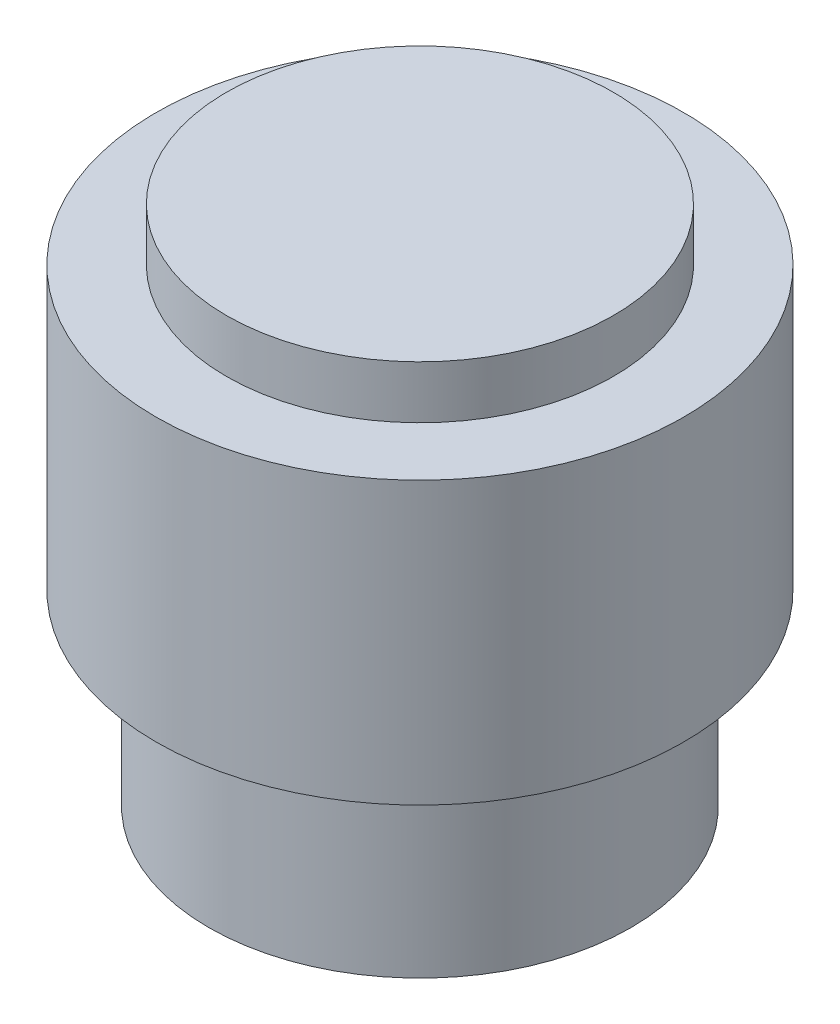
ISO-10303-21;
HEADER;
FILE_DESCRIPTION(('STEP AP214'),'2;1');
FILE_NAME('part.step','',(''),(''),'','','');
FILE_SCHEMA(('AUTOMOTIVE_DESIGN { 1 0 10303 214 1 1 1 1 }'));
ENDSEC;
DATA;
#1=APPLICATION_CONTEXT('core data for automotive mechanical design processes');
#2=APPLICATION_PROTOCOL_DEFINITION('international standard','automotive_design',2000,#1);
#3=PRODUCT_CONTEXT('',#1,'mechanical');
#4=PRODUCT('Part','Part','',(#3));
#5=PRODUCT_RELATED_PRODUCT_CATEGORY('part','',(#4));
#6=PRODUCT_DEFINITION_FORMATION('','',#4);
#7=PRODUCT_DEFINITION_CONTEXT('part definition',#1,'design');
#8=PRODUCT_DEFINITION('design','',#6,#7);
#9=PRODUCT_DEFINITION_SHAPE('','',#8);
#10=(LENGTH_UNIT() NAMED_UNIT(*) SI_UNIT(.MILLI.,.METRE.));
#11=(NAMED_UNIT(*) PLANE_ANGLE_UNIT() SI_UNIT($,.RADIAN.));
#12=(NAMED_UNIT(*) SI_UNIT($,.STERADIAN.) SOLID_ANGLE_UNIT());
#13=UNCERTAINTY_MEASURE_WITH_UNIT(LENGTH_MEASURE(1.E-05),#10,'distance_accuracy_value','');
#14=(GEOMETRIC_REPRESENTATION_CONTEXT(3) GLOBAL_UNCERTAINTY_ASSIGNED_CONTEXT((#13)) GLOBAL_UNIT_ASSIGNED_CONTEXT((#10,
#11,#12)) REPRESENTATION_CONTEXT('',''));
#15=CARTESIAN_POINT('',(0.,0.,0.));
#16=DIRECTION('',(0.,0.,1.));
#17=DIRECTION('',(1.,0.,0.));
#18=AXIS2_PLACEMENT_3D('',#15,#16,#17);
#19=CARTESIAN_POINT('',(0.,1.83,0.));
#20=DIRECTION('',(0.,-1.,0.));
#21=DIRECTION('',(0.,0.,-1.));
#22=AXIS2_PLACEMENT_3D('',#19,#20,#21);
#23=CYLINDRICAL_SURFACE('',#22,6.);
#24=CARTESIAN_POINT('',(0.,-3.5,0.));
#25=DIRECTION('',(0.,1.,0.));
#26=DIRECTION('',(0.,0.,1.));
#27=AXIS2_PLACEMENT_3D('',#24,#25,#26);
#28=CIRCLE('',#27,6.);
#29=CARTESIAN_POINT('',(0.,-3.5,6.));
#30=VERTEX_POINT('',#29);
#31=EDGE_CURVE('E42',#30,#30,#28,.T.);
#32=ORIENTED_EDGE('',*,*,#31,.T.);
#33=EDGE_LOOP('',(#32));
#34=FACE_BOUND('',#33,.T.);
#35=CARTESIAN_POINT('',(0.,1.82,0.));
#36=DIRECTION('',(0.,1.,0.));
#37=DIRECTION('',(0.,0.,1.));
#38=AXIS2_PLACEMENT_3D('',#35,#36,#37);
#39=CIRCLE('',#38,6.);
#40=CARTESIAN_POINT('',(0.,1.82,6.));
#41=VERTEX_POINT('',#40);
#42=EDGE_CURVE('E10',#41,#41,#39,.T.);
#43=ORIENTED_EDGE('',*,*,#42,.F.);
#44=EDGE_LOOP('',(#43));
#45=FACE_BOUND('',#44,.T.);
#46=ADVANCED_FACE('F40',(#34,#45),#23,.T.);
#47=CARTESIAN_POINT('',(0.,-3.5,0.));
#48=DIRECTION('',(0.,1.,0.));
#49=DIRECTION('',(0.,0.,1.));
#50=AXIS2_PLACEMENT_3D('',#47,#48,#49);
#51=PLANE('',#50);
#52=ORIENTED_EDGE('',*,*,#31,.F.);
#53=EDGE_LOOP('',(#52));
#54=FACE_BOUND('',#53,.T.);
#55=ADVANCED_FACE('F84',(#54),#51,.F.);
#56=CARTESIAN_POINT('',(0.,9.82,0.));
#57=DIRECTION('',(0.,-1.,0.));
#58=DIRECTION('',(0.,0.,-1.));
#59=AXIS2_PLACEMENT_3D('',#56,#57,#58);
#60=CYLINDRICAL_SURFACE('',#59,7.5);
#61=CARTESIAN_POINT('',(0.,9.82,0.));
#62=DIRECTION('',(0.,1.,0.));
#63=DIRECTION('',(0.,0.,1.));
#64=AXIS2_PLACEMENT_3D('',#61,#62,#63);
#65=CIRCLE('',#64,7.5);
#66=CARTESIAN_POINT('',(0.,9.82,7.5));
#67=VERTEX_POINT('',#66);
#68=EDGE_CURVE('E48',#67,#67,#65,.T.);
#69=ORIENTED_EDGE('',*,*,#68,.F.);
#70=EDGE_LOOP('',(#69));
#71=FACE_BOUND('',#70,.T.);
#72=CARTESIAN_POINT('',(0.,1.82,0.));
#73=DIRECTION('',(0.,1.,0.));
#74=DIRECTION('',(0.,0.,1.));
#75=AXIS2_PLACEMENT_3D('',#72,#73,#74);
#76=CIRCLE('',#75,7.5);
#77=CARTESIAN_POINT('',(0.,1.82,7.5));
#78=VERTEX_POINT('',#77);
#79=EDGE_CURVE('E51',#78,#78,#76,.T.);
#80=ORIENTED_EDGE('',*,*,#79,.T.);
#81=EDGE_LOOP('',(#80));
#82=FACE_BOUND('',#81,.T.);
#83=ADVANCED_FACE('F87',(#71,#82),#60,.T.);
#84=CARTESIAN_POINT('',(0.,9.82,0.));
#85=DIRECTION('',(0.,1.,0.));
#86=DIRECTION('',(0.,0.,1.));
#87=AXIS2_PLACEMENT_3D('',#84,#85,#86);
#88=PLANE('',#87);
#89=CARTESIAN_POINT('',(0.,9.82,0.));
#90=DIRECTION('',(0.,1.,0.));
#91=DIRECTION('',(0.,0.,1.));
#92=AXIS2_PLACEMENT_3D('',#89,#90,#91);
#93=CIRCLE('',#92,5.5);
#94=CARTESIAN_POINT('',(0.,9.82,5.5));
#95=VERTEX_POINT('',#94);
#96=EDGE_CURVE('E37',#95,#95,#93,.F.);
#97=ORIENTED_EDGE('',*,*,#96,.T.);
#98=EDGE_LOOP('',(#97));
#99=FACE_BOUND('',#98,.T.);
#100=ORIENTED_EDGE('',*,*,#68,.T.);
#101=EDGE_LOOP('',(#100));
#102=FACE_BOUND('',#101,.T.);
#103=ADVANCED_FACE('F65',(#99,#102),#88,.T.);
#104=CARTESIAN_POINT('',(0.,1.82,0.));
#105=DIRECTION('',(0.,1.,0.));
#106=DIRECTION('',(0.,0.,1.));
#107=AXIS2_PLACEMENT_3D('',#104,#105,#106);
#108=PLANE('',#107);
#109=ORIENTED_EDGE('',*,*,#42,.T.);
#110=EDGE_LOOP('',(#109));
#111=FACE_BOUND('',#110,.T.);
#112=ORIENTED_EDGE('',*,*,#79,.F.);
#113=EDGE_LOOP('',(#112));
#114=FACE_BOUND('',#113,.T.);
#115=ADVANCED_FACE('F67',(#111,#114),#108,.F.);
#116=CARTESIAN_POINT('',(0.,11.32,0.));
#117=DIRECTION('',(0.,-1.,0.));
#118=DIRECTION('',(0.,0.,-1.));
#119=AXIS2_PLACEMENT_3D('',#116,#117,#118);
#120=CYLINDRICAL_SURFACE('',#119,5.5);
#121=ORIENTED_EDGE('',*,*,#96,.F.);
#122=EDGE_LOOP('',(#121));
#123=FACE_BOUND('',#122,.T.);
#124=CARTESIAN_POINT('',(0.,11.32,0.));
#125=DIRECTION('',(0.,1.,0.));
#126=DIRECTION('',(0.,0.,1.));
#127=AXIS2_PLACEMENT_3D('',#124,#125,#126);
#128=CIRCLE('',#127,5.5);
#129=CARTESIAN_POINT('',(0.,11.32,5.5));
#130=VERTEX_POINT('',#129);
#131=EDGE_CURVE('E57',#130,#130,#128,.T.);
#132=ORIENTED_EDGE('',*,*,#131,.F.);
#133=EDGE_LOOP('',(#132));
#134=FACE_BOUND('',#133,.T.);
#135=ADVANCED_FACE('F69',(#123,#134),#120,.T.);
#136=CARTESIAN_POINT('',(0.,11.32,0.));
#137=DIRECTION('',(0.,1.,0.));
#138=DIRECTION('',(0.,0.,1.));
#139=AXIS2_PLACEMENT_3D('',#136,#137,#138);
#140=PLANE('',#139);
#141=ORIENTED_EDGE('',*,*,#131,.T.);
#142=EDGE_LOOP('',(#141));
#143=FACE_BOUND('',#142,.T.);
#144=ADVANCED_FACE('F68',(#143),#140,.T.);
#145=CLOSED_SHELL('',(#46,#55,#83,#103,#115,#135,#144));
#146=MANIFOLD_SOLID_BREP('B2',#145);
#147=ADVANCED_BREP_SHAPE_REPRESENTATION('',(#18,#146),#14);
#148=SHAPE_DEFINITION_REPRESENTATION(#9,#147);
ENDSEC;
END-ISO-10303-21;
